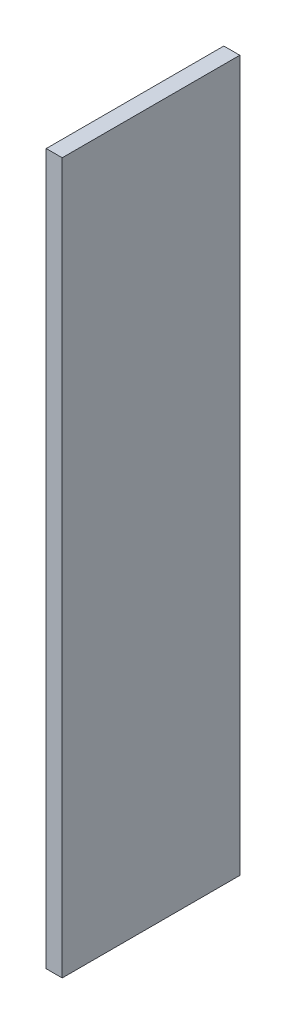
ISO-10303-21;
HEADER;
FILE_DESCRIPTION(('STEP AP214'),'2;1');
FILE_NAME('part.step','',(''),(''),'','','');
FILE_SCHEMA(('AUTOMOTIVE_DESIGN { 1 0 10303 214 1 1 1 1 }'));
ENDSEC;
DATA;
#1=APPLICATION_CONTEXT('core data for automotive mechanical design processes');
#2=APPLICATION_PROTOCOL_DEFINITION('international standard','automotive_design',2000,#1);
#3=PRODUCT_CONTEXT('',#1,'mechanical');
#4=PRODUCT('Part','Part','',(#3));
#5=PRODUCT_RELATED_PRODUCT_CATEGORY('part','',(#4));
#6=PRODUCT_DEFINITION_FORMATION('','',#4);
#7=PRODUCT_DEFINITION_CONTEXT('part definition',#1,'design');
#8=PRODUCT_DEFINITION('design','',#6,#7);
#9=PRODUCT_DEFINITION_SHAPE('','',#8);
#10=(LENGTH_UNIT() NAMED_UNIT(*) SI_UNIT(.MILLI.,.METRE.));
#11=(NAMED_UNIT(*) PLANE_ANGLE_UNIT() SI_UNIT($,.RADIAN.));
#12=(NAMED_UNIT(*) SI_UNIT($,.STERADIAN.) SOLID_ANGLE_UNIT());
#13=UNCERTAINTY_MEASURE_WITH_UNIT(LENGTH_MEASURE(1.E-05),#10,'distance_accuracy_value','');
#14=(GEOMETRIC_REPRESENTATION_CONTEXT(3) GLOBAL_UNCERTAINTY_ASSIGNED_CONTEXT((#13)) GLOBAL_UNIT_ASSIGNED_CONTEXT((#10,
#11,#12)) REPRESENTATION_CONTEXT('',''));
#15=CARTESIAN_POINT('',(0.,0.,0.));
#16=DIRECTION('',(0.,0.,1.));
#17=DIRECTION('',(1.,0.,0.));
#18=AXIS2_PLACEMENT_3D('',#15,#16,#17);
#19=CARTESIAN_POINT('',(18.,0.,0.));
#20=DIRECTION('',(0.,0.,-1.));
#21=DIRECTION('',(-1.,0.,0.));
#22=AXIS2_PLACEMENT_3D('',#19,#20,#21);
#23=PLANE('',#22);
#24=DIRECTION('',(0.,-1.,0.));
#25=VECTOR('',#24,1.);
#26=CARTESIAN_POINT('',(0.,0.,0.));
#27=LINE('',#26,#25);
#28=CARTESIAN_POINT('',(0.,800.,0.));
#29=VERTEX_POINT('',#28);
#30=CARTESIAN_POINT('',(0.,0.,0.));
#31=VERTEX_POINT('',#30);
#32=EDGE_CURVE('E95',#29,#31,#27,.T.);
#33=ORIENTED_EDGE('',*,*,#32,.T.);
#34=DIRECTION('',(-1.,0.,0.));
#35=VECTOR('',#34,1.);
#36=CARTESIAN_POINT('',(18.,0.,0.));
#37=LINE('',#36,#35);
#38=CARTESIAN_POINT('',(18.,0.,0.));
#39=VERTEX_POINT('',#38);
#40=EDGE_CURVE('E11',#39,#31,#37,.T.);
#41=ORIENTED_EDGE('',*,*,#40,.F.);
#42=DIRECTION('',(0.,-1.,0.));
#43=VECTOR('',#42,1.);
#44=CARTESIAN_POINT('',(18.,0.,0.));
#45=LINE('',#44,#43);
#46=CARTESIAN_POINT('',(18.,800.,0.));
#47=VERTEX_POINT('',#46);
#48=EDGE_CURVE('E83',#47,#39,#45,.T.);
#49=ORIENTED_EDGE('',*,*,#48,.F.);
#50=DIRECTION('',(-1.,0.,0.));
#51=VECTOR('',#50,1.);
#52=CARTESIAN_POINT('',(18.,800.,0.));
#53=LINE('',#52,#51);
#54=EDGE_CURVE('E91',#47,#29,#53,.T.);
#55=ORIENTED_EDGE('',*,*,#54,.T.);
#56=EDGE_LOOP('',(#33,#41,#49,#55));
#57=FACE_BOUND('',#56,.T.);
#58=ADVANCED_FACE('F32',(#57),#23,.F.);
#59=CARTESIAN_POINT('',(18.,0.,0.));
#60=DIRECTION('',(0.,1.,0.));
#61=DIRECTION('',(0.,0.,1.));
#62=AXIS2_PLACEMENT_3D('',#59,#60,#61);
#63=PLANE('',#62);
#64=DIRECTION('',(0.,0.,-1.));
#65=VECTOR('',#64,1.);
#66=CARTESIAN_POINT('',(0.,0.,0.));
#67=LINE('',#66,#65);
#68=CARTESIAN_POINT('',(0.,0.,-200.));
#69=VERTEX_POINT('',#68);
#70=EDGE_CURVE('E87',#31,#69,#67,.T.);
#71=ORIENTED_EDGE('',*,*,#70,.T.);
#72=DIRECTION('',(-1.,0.,0.));
#73=VECTOR('',#72,1.);
#74=CARTESIAN_POINT('',(18.,0.,-200.));
#75=LINE('',#74,#73);
#76=CARTESIAN_POINT('',(18.,0.,-200.));
#77=VERTEX_POINT('',#76);
#78=EDGE_CURVE('E40',#77,#69,#75,.T.);
#79=ORIENTED_EDGE('',*,*,#78,.F.);
#80=DIRECTION('',(0.,0.,-1.));
#81=VECTOR('',#80,1.);
#82=CARTESIAN_POINT('',(18.,0.,0.));
#83=LINE('',#82,#81);
#84=EDGE_CURVE('E78',#39,#77,#83,.T.);
#85=ORIENTED_EDGE('',*,*,#84,.F.);
#86=ORIENTED_EDGE('',*,*,#40,.T.);
#87=EDGE_LOOP('',(#71,#79,#85,#86));
#88=FACE_BOUND('',#87,.T.);
#89=ADVANCED_FACE('F86',(#88),#63,.F.);
#90=CARTESIAN_POINT('',(18.,0.,-200.));
#91=DIRECTION('',(0.,0.,1.));
#92=DIRECTION('',(1.,0.,0.));
#93=AXIS2_PLACEMENT_3D('',#90,#91,#92);
#94=PLANE('',#93);
#95=DIRECTION('',(0.,1.,0.));
#96=VECTOR('',#95,1.);
#97=CARTESIAN_POINT('',(0.,0.,-200.));
#98=LINE('',#97,#96);
#99=CARTESIAN_POINT('',(0.,800.,-200.));
#100=VERTEX_POINT('',#99);
#101=EDGE_CURVE('E65',#69,#100,#98,.T.);
#102=ORIENTED_EDGE('',*,*,#101,.T.);
#103=DIRECTION('',(-1.,0.,0.));
#104=VECTOR('',#103,1.);
#105=CARTESIAN_POINT('',(18.,800.,-200.));
#106=LINE('',#105,#104);
#107=CARTESIAN_POINT('',(18.,800.,-200.));
#108=VERTEX_POINT('',#107);
#109=EDGE_CURVE('E88',#108,#100,#106,.T.);
#110=ORIENTED_EDGE('',*,*,#109,.F.);
#111=DIRECTION('',(0.,1.,0.));
#112=VECTOR('',#111,1.);
#113=CARTESIAN_POINT('',(18.,0.,-200.));
#114=LINE('',#113,#112);
#115=EDGE_CURVE('E81',#77,#108,#114,.T.);
#116=ORIENTED_EDGE('',*,*,#115,.F.);
#117=ORIENTED_EDGE('',*,*,#78,.T.);
#118=EDGE_LOOP('',(#102,#110,#116,#117));
#119=FACE_BOUND('',#118,.T.);
#120=ADVANCED_FACE('F89',(#119),#94,.F.);
#121=CARTESIAN_POINT('',(18.,800.,0.));
#122=DIRECTION('',(0.,-1.,0.));
#123=DIRECTION('',(0.,0.,-1.));
#124=AXIS2_PLACEMENT_3D('',#121,#122,#123);
#125=PLANE('',#124);
#126=DIRECTION('',(0.,0.,1.));
#127=VECTOR('',#126,1.);
#128=CARTESIAN_POINT('',(0.,800.,0.));
#129=LINE('',#128,#127);
#130=EDGE_CURVE('E71',#100,#29,#129,.T.);
#131=ORIENTED_EDGE('',*,*,#130,.T.);
#132=ORIENTED_EDGE('',*,*,#54,.F.);
#133=DIRECTION('',(0.,0.,1.));
#134=VECTOR('',#133,1.);
#135=CARTESIAN_POINT('',(18.,800.,0.));
#136=LINE('',#135,#134);
#137=EDGE_CURVE('E48',#108,#47,#136,.T.);
#138=ORIENTED_EDGE('',*,*,#137,.F.);
#139=ORIENTED_EDGE('',*,*,#109,.T.);
#140=EDGE_LOOP('',(#131,#132,#138,#139));
#141=FACE_BOUND('',#140,.T.);
#142=ADVANCED_FACE('F102',(#141),#125,.F.);
#143=CARTESIAN_POINT('',(18.,0.,0.));
#144=DIRECTION('',(-1.,0.,0.));
#145=DIRECTION('',(0.,0.,1.));
#146=AXIS2_PLACEMENT_3D('',#143,#144,#145);
#147=PLANE('',#146);
#148=ORIENTED_EDGE('',*,*,#48,.T.);
#149=ORIENTED_EDGE('',*,*,#84,.T.);
#150=ORIENTED_EDGE('',*,*,#115,.T.);
#151=ORIENTED_EDGE('',*,*,#137,.T.);
#152=EDGE_LOOP('',(#148,#149,#150,#151));
#153=FACE_BOUND('',#152,.T.);
#154=ADVANCED_FACE('F79',(#153),#147,.F.);
#155=CARTESIAN_POINT('',(0.,0.,0.));
#156=DIRECTION('',(-1.,0.,0.));
#157=DIRECTION('',(0.,0.,1.));
#158=AXIS2_PLACEMENT_3D('',#155,#156,#157);
#159=PLANE('',#158);
#160=ORIENTED_EDGE('',*,*,#32,.F.);
#161=ORIENTED_EDGE('',*,*,#130,.F.);
#162=ORIENTED_EDGE('',*,*,#101,.F.);
#163=ORIENTED_EDGE('',*,*,#70,.F.);
#164=EDGE_LOOP('',(#160,#161,#162,#163));
#165=FACE_BOUND('',#164,.T.);
#166=ADVANCED_FACE('F105',(#165),#159,.T.);
#167=CLOSED_SHELL('',(#58,#89,#120,#142,#154,#166));
#168=MANIFOLD_SOLID_BREP('B2',#167);
#169=ADVANCED_BREP_SHAPE_REPRESENTATION('',(#18,#168),#14);
#170=SHAPE_DEFINITION_REPRESENTATION(#9,#169);
ENDSEC;
END-ISO-10303-21;
